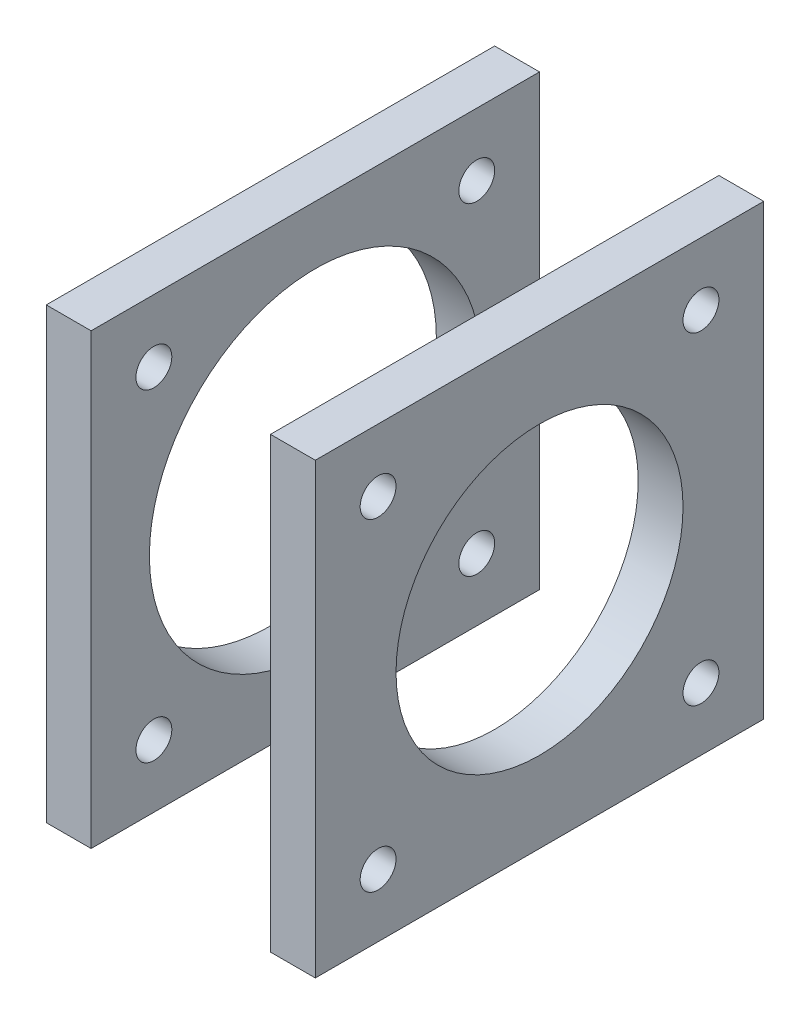
ISO-10303-21;
HEADER;
FILE_DESCRIPTION(('STEP AP214'),'2;1');
FILE_NAME('part.step','',(''),(''),'','','');
FILE_SCHEMA(('AUTOMOTIVE_DESIGN { 1 0 10303 214 1 1 1 1 }'));
ENDSEC;
DATA;
#1=APPLICATION_CONTEXT('core data for automotive mechanical design processes');
#2=APPLICATION_PROTOCOL_DEFINITION('international standard','automotive_design',2000,#1);
#3=PRODUCT_CONTEXT('',#1,'mechanical');
#4=PRODUCT('Part','Part','',(#3));
#5=PRODUCT_RELATED_PRODUCT_CATEGORY('part','',(#4));
#6=PRODUCT_DEFINITION_FORMATION('','',#4);
#7=PRODUCT_DEFINITION_CONTEXT('part definition',#1,'design');
#8=PRODUCT_DEFINITION('design','',#6,#7);
#9=PRODUCT_DEFINITION_SHAPE('','',#8);
#10=(LENGTH_UNIT() NAMED_UNIT(*) SI_UNIT(.MILLI.,.METRE.));
#11=(NAMED_UNIT(*) PLANE_ANGLE_UNIT() SI_UNIT($,.RADIAN.));
#12=(NAMED_UNIT(*) SI_UNIT($,.STERADIAN.) SOLID_ANGLE_UNIT());
#13=UNCERTAINTY_MEASURE_WITH_UNIT(LENGTH_MEASURE(1.E-05),#10,'distance_accuracy_value','');
#14=(GEOMETRIC_REPRESENTATION_CONTEXT(3) GLOBAL_UNCERTAINTY_ASSIGNED_CONTEXT((#13)) GLOBAL_UNIT_ASSIGNED_CONTEXT((#10,
#11,#12)) REPRESENTATION_CONTEXT('',''));
#15=CARTESIAN_POINT('',(0.,0.,0.));
#16=DIRECTION('',(0.,0.,1.));
#17=DIRECTION('',(1.,0.,0.));
#18=AXIS2_PLACEMENT_3D('',#15,#16,#17);
#19=CARTESIAN_POINT('',(30.,0.,0.));
#20=DIRECTION('',(1.,0.,0.));
#21=DIRECTION('',(0.,0.,-1.));
#22=AXIS2_PLACEMENT_3D('',#19,#20,#21);
#23=PLANE('',#22);
#24=CARTESIAN_POINT('',(30.,-24.9155322091732,-25.5692182725278));
#25=DIRECTION('',(1.,0.,0.));
#26=DIRECTION('',(0.,0.,-1.));
#27=AXIS2_PLACEMENT_3D('',#24,#25,#26);
#28=CIRCLE('',#27,2.);
#29=CARTESIAN_POINT('',(30.,-24.9155322091732,-27.5692182725278));
#30=VERTEX_POINT('',#29);
#31=EDGE_CURVE('E137',#30,#30,#28,.T.);
#32=ORIENTED_EDGE('',*,*,#31,.F.);
#33=EDGE_LOOP('',(#32));
#34=FACE_BOUND('',#33,.T.);
#35=CARTESIAN_POINT('',(30.,11.0844677908268,10.4307817274722));
#36=DIRECTION('',(1.,0.,0.));
#37=DIRECTION('',(0.,0.,-1.));
#38=AXIS2_PLACEMENT_3D('',#35,#36,#37);
#39=CIRCLE('',#38,2.);
#40=CARTESIAN_POINT('',(30.,11.0844677908268,8.43078172747223));
#41=VERTEX_POINT('',#40);
#42=EDGE_CURVE('E125',#41,#41,#39,.T.);
#43=ORIENTED_EDGE('',*,*,#42,.F.);
#44=EDGE_LOOP('',(#43));
#45=FACE_BOUND('',#44,.T.);
#46=DIRECTION('',(0.,-1.,0.));
#47=VECTOR('',#46,1.);
#48=CARTESIAN_POINT('',(30.,18.0844677908268,17.4307817274722));
#49=LINE('',#48,#47);
#50=CARTESIAN_POINT('',(30.,18.0844677908268,17.4307817274722));
#51=VERTEX_POINT('',#50);
#52=CARTESIAN_POINT('',(30.,-31.9155322091732,17.4307817274722));
#53=VERTEX_POINT('',#52);
#54=EDGE_CURVE('E95',#51,#53,#49,.T.);
#55=ORIENTED_EDGE('',*,*,#54,.T.);
#56=DIRECTION('',(0.,0.,-1.));
#57=VECTOR('',#56,1.);
#58=CARTESIAN_POINT('',(30.,-31.9155322091732,17.4307817274722));
#59=LINE('',#58,#57);
#60=CARTESIAN_POINT('',(30.,-31.9155322091732,-32.5692182725278));
#61=VERTEX_POINT('',#60);
#62=EDGE_CURVE('E90',#53,#61,#59,.T.);
#63=ORIENTED_EDGE('',*,*,#62,.T.);
#64=DIRECTION('',(0.,1.,0.));
#65=VECTOR('',#64,1.);
#66=CARTESIAN_POINT('',(30.,-31.9155322091732,-32.5692182725278));
#67=LINE('',#66,#65);
#68=CARTESIAN_POINT('',(30.,18.0844677908268,-32.5692182725278));
#69=VERTEX_POINT('',#68);
#70=EDGE_CURVE('E93',#61,#69,#67,.T.);
#71=ORIENTED_EDGE('',*,*,#70,.T.);
#72=DIRECTION('',(0.,0.,1.));
#73=VECTOR('',#72,1.);
#74=CARTESIAN_POINT('',(30.,18.0844677908268,-32.5692182725278));
#75=LINE('',#74,#73);
#76=EDGE_CURVE('E60',#69,#51,#75,.T.);
#77=ORIENTED_EDGE('',*,*,#76,.T.);
#78=EDGE_LOOP('',(#55,#63,#71,#77));
#79=FACE_BOUND('',#78,.T.);
#80=CARTESIAN_POINT('',(30.,-24.9155322091732,10.4307817274722));
#81=DIRECTION('',(1.,0.,0.));
#82=DIRECTION('',(0.,0.,-1.));
#83=AXIS2_PLACEMENT_3D('',#80,#81,#82);
#84=CIRCLE('',#83,2.);
#85=CARTESIAN_POINT('',(30.,-24.9155322091732,8.43078172747223));
#86=VERTEX_POINT('',#85);
#87=EDGE_CURVE('E110',#86,#86,#84,.T.);
#88=ORIENTED_EDGE('',*,*,#87,.F.);
#89=EDGE_LOOP('',(#88));
#90=FACE_BOUND('',#89,.T.);
#91=CARTESIAN_POINT('',(30.,11.0844677908268,-25.5692182725278));
#92=DIRECTION('',(1.,0.,0.));
#93=DIRECTION('',(0.,0.,-1.));
#94=AXIS2_PLACEMENT_3D('',#91,#92,#93);
#95=CIRCLE('',#94,2.);
#96=CARTESIAN_POINT('',(30.,11.0844677908268,-27.5692182725278));
#97=VERTEX_POINT('',#96);
#98=EDGE_CURVE('E131',#97,#97,#95,.T.);
#99=ORIENTED_EDGE('',*,*,#98,.F.);
#100=EDGE_LOOP('',(#99));
#101=FACE_BOUND('',#100,.T.);
#102=CARTESIAN_POINT('',(30.,-6.91553220917321,-7.56921827252777));
#103=DIRECTION('',(1.,0.,0.));
#104=DIRECTION('',(0.,0.,-1.));
#105=AXIS2_PLACEMENT_3D('',#102,#103,#104);
#106=CIRCLE('',#105,16.);
#107=CARTESIAN_POINT('',(30.,-6.91553220917321,-23.5692182725278));
#108=VERTEX_POINT('',#107);
#109=EDGE_CURVE('E143',#108,#108,#106,.T.);
#110=ORIENTED_EDGE('',*,*,#109,.F.);
#111=EDGE_LOOP('',(#110));
#112=FACE_BOUND('',#111,.T.);
#113=ADVANCED_FACE('F43',(#34,#45,#79,#90,#101,#112),#23,.T.);
#114=CARTESIAN_POINT('',(25.,0.,0.));
#115=DIRECTION('',(1.,0.,0.));
#116=DIRECTION('',(0.,0.,-1.));
#117=AXIS2_PLACEMENT_3D('',#114,#115,#116);
#118=PLANE('',#117);
#119=DIRECTION('',(0.,-1.,0.));
#120=VECTOR('',#119,1.);
#121=CARTESIAN_POINT('',(25.,18.0844677908268,17.4307817274722));
#122=LINE('',#121,#120);
#123=CARTESIAN_POINT('',(25.,18.0844677908268,17.4307817274722));
#124=VERTEX_POINT('',#123);
#125=CARTESIAN_POINT('',(25.,-31.9155322091732,17.4307817274722));
#126=VERTEX_POINT('',#125);
#127=EDGE_CURVE('E107',#124,#126,#122,.T.);
#128=ORIENTED_EDGE('',*,*,#127,.F.);
#129=DIRECTION('',(0.,0.,1.));
#130=VECTOR('',#129,1.);
#131=CARTESIAN_POINT('',(25.,18.0844677908268,-32.5692182725278));
#132=LINE('',#131,#130);
#133=CARTESIAN_POINT('',(25.,18.0844677908268,-32.5692182725278));
#134=VERTEX_POINT('',#133);
#135=EDGE_CURVE('E83',#134,#124,#132,.T.);
#136=ORIENTED_EDGE('',*,*,#135,.F.);
#137=DIRECTION('',(0.,1.,0.));
#138=VECTOR('',#137,1.);
#139=CARTESIAN_POINT('',(25.,-31.9155322091732,-32.5692182725278));
#140=LINE('',#139,#138);
#141=CARTESIAN_POINT('',(25.,-31.9155322091732,-32.5692182725278));
#142=VERTEX_POINT('',#141);
#143=EDGE_CURVE('E77',#142,#134,#140,.T.);
#144=ORIENTED_EDGE('',*,*,#143,.F.);
#145=DIRECTION('',(0.,0.,-1.));
#146=VECTOR('',#145,1.);
#147=CARTESIAN_POINT('',(25.,-31.9155322091732,17.4307817274722));
#148=LINE('',#147,#146);
#149=EDGE_CURVE('E99',#126,#142,#148,.T.);
#150=ORIENTED_EDGE('',*,*,#149,.F.);
#151=EDGE_LOOP('',(#128,#136,#144,#150));
#152=FACE_BOUND('',#151,.T.);
#153=CARTESIAN_POINT('',(25.,-24.9155322091732,10.4307817274722));
#154=DIRECTION('',(1.,0.,0.));
#155=DIRECTION('',(0.,0.,-1.));
#156=AXIS2_PLACEMENT_3D('',#153,#154,#155);
#157=CIRCLE('',#156,2.);
#158=CARTESIAN_POINT('',(25.,-24.9155322091732,8.43078172747223));
#159=VERTEX_POINT('',#158);
#160=EDGE_CURVE('E122',#159,#159,#157,.T.);
#161=ORIENTED_EDGE('',*,*,#160,.T.);
#162=EDGE_LOOP('',(#161));
#163=FACE_BOUND('',#162,.T.);
#164=CARTESIAN_POINT('',(25.,11.0844677908268,10.4307817274722));
#165=DIRECTION('',(1.,0.,0.));
#166=DIRECTION('',(0.,0.,-1.));
#167=AXIS2_PLACEMENT_3D('',#164,#165,#166);
#168=CIRCLE('',#167,2.);
#169=CARTESIAN_POINT('',(25.,11.0844677908268,8.43078172747223));
#170=VERTEX_POINT('',#169);
#171=EDGE_CURVE('E128',#170,#170,#168,.T.);
#172=ORIENTED_EDGE('',*,*,#171,.T.);
#173=EDGE_LOOP('',(#172));
#174=FACE_BOUND('',#173,.T.);
#175=CARTESIAN_POINT('',(25.,11.0844677908268,-25.5692182725278));
#176=DIRECTION('',(1.,0.,0.));
#177=DIRECTION('',(0.,0.,-1.));
#178=AXIS2_PLACEMENT_3D('',#175,#176,#177);
#179=CIRCLE('',#178,2.);
#180=CARTESIAN_POINT('',(25.,11.0844677908268,-27.5692182725278));
#181=VERTEX_POINT('',#180);
#182=EDGE_CURVE('E134',#181,#181,#179,.T.);
#183=ORIENTED_EDGE('',*,*,#182,.T.);
#184=EDGE_LOOP('',(#183));
#185=FACE_BOUND('',#184,.T.);
#186=CARTESIAN_POINT('',(25.,-24.9155322091732,-25.5692182725278));
#187=DIRECTION('',(1.,0.,0.));
#188=DIRECTION('',(0.,0.,-1.));
#189=AXIS2_PLACEMENT_3D('',#186,#187,#188);
#190=CIRCLE('',#189,2.);
#191=CARTESIAN_POINT('',(25.,-24.9155322091732,-27.5692182725278));
#192=VERTEX_POINT('',#191);
#193=EDGE_CURVE('E140',#192,#192,#190,.T.);
#194=ORIENTED_EDGE('',*,*,#193,.T.);
#195=EDGE_LOOP('',(#194));
#196=FACE_BOUND('',#195,.T.);
#197=CARTESIAN_POINT('',(25.,-6.91553220917321,-7.56921827252777));
#198=DIRECTION('',(1.,0.,0.));
#199=DIRECTION('',(0.,0.,-1.));
#200=AXIS2_PLACEMENT_3D('',#197,#198,#199);
#201=CIRCLE('',#200,16.);
#202=CARTESIAN_POINT('',(25.,-6.91553220917321,-23.5692182725278));
#203=VERTEX_POINT('',#202);
#204=EDGE_CURVE('E146',#203,#203,#201,.T.);
#205=ORIENTED_EDGE('',*,*,#204,.T.);
#206=EDGE_LOOP('',(#205));
#207=FACE_BOUND('',#206,.T.);
#208=ADVANCED_FACE('F118',(#152,#163,#174,#185,#196,#207),#118,.F.);
#209=CARTESIAN_POINT('',(30.,18.0844677908268,17.4307817274722));
#210=DIRECTION('',(0.,0.,-1.));
#211=DIRECTION('',(-1.,0.,0.));
#212=AXIS2_PLACEMENT_3D('',#209,#210,#211);
#213=PLANE('',#212);
#214=ORIENTED_EDGE('',*,*,#127,.T.);
#215=DIRECTION('',(-1.,0.,0.));
#216=VECTOR('',#215,1.);
#217=CARTESIAN_POINT('',(30.,-31.9155322091732,17.4307817274722));
#218=LINE('',#217,#216);
#219=EDGE_CURVE('E12',#53,#126,#218,.T.);
#220=ORIENTED_EDGE('',*,*,#219,.F.);
#221=ORIENTED_EDGE('',*,*,#54,.F.);
#222=DIRECTION('',(-1.,0.,0.));
#223=VECTOR('',#222,1.);
#224=CARTESIAN_POINT('',(30.,18.0844677908268,17.4307817274722));
#225=LINE('',#224,#223);
#226=EDGE_CURVE('E103',#51,#124,#225,.T.);
#227=ORIENTED_EDGE('',*,*,#226,.T.);
#228=EDGE_LOOP('',(#214,#220,#221,#227));
#229=FACE_BOUND('',#228,.T.);
#230=ADVANCED_FACE('F45',(#229),#213,.F.);
#231=CARTESIAN_POINT('',(30.,-31.9155322091732,17.4307817274722));
#232=DIRECTION('',(0.,1.,0.));
#233=DIRECTION('',(0.,0.,1.));
#234=AXIS2_PLACEMENT_3D('',#231,#232,#233);
#235=PLANE('',#234);
#236=ORIENTED_EDGE('',*,*,#149,.T.);
#237=DIRECTION('',(-1.,0.,0.));
#238=VECTOR('',#237,1.);
#239=CARTESIAN_POINT('',(30.,-31.9155322091732,-32.5692182725278));
#240=LINE('',#239,#238);
#241=EDGE_CURVE('E52',#61,#142,#240,.T.);
#242=ORIENTED_EDGE('',*,*,#241,.F.);
#243=ORIENTED_EDGE('',*,*,#62,.F.);
#244=ORIENTED_EDGE('',*,*,#219,.T.);
#245=EDGE_LOOP('',(#236,#242,#243,#244));
#246=FACE_BOUND('',#245,.T.);
#247=ADVANCED_FACE('F98',(#246),#235,.F.);
#248=CARTESIAN_POINT('',(30.,-31.9155322091732,-32.5692182725278));
#249=DIRECTION('',(0.,0.,1.));
#250=DIRECTION('',(1.,0.,0.));
#251=AXIS2_PLACEMENT_3D('',#248,#249,#250);
#252=PLANE('',#251);
#253=ORIENTED_EDGE('',*,*,#143,.T.);
#254=DIRECTION('',(-1.,0.,0.));
#255=VECTOR('',#254,1.);
#256=CARTESIAN_POINT('',(30.,18.0844677908268,-32.5692182725278));
#257=LINE('',#256,#255);
#258=EDGE_CURVE('E100',#69,#134,#257,.T.);
#259=ORIENTED_EDGE('',*,*,#258,.F.);
#260=ORIENTED_EDGE('',*,*,#70,.F.);
#261=ORIENTED_EDGE('',*,*,#241,.T.);
#262=EDGE_LOOP('',(#253,#259,#260,#261));
#263=FACE_BOUND('',#262,.T.);
#264=ADVANCED_FACE('F101',(#263),#252,.F.);
#265=CARTESIAN_POINT('',(30.,18.0844677908268,-32.5692182725278));
#266=DIRECTION('',(0.,-1.,0.));
#267=DIRECTION('',(0.,0.,-1.));
#268=AXIS2_PLACEMENT_3D('',#265,#266,#267);
#269=PLANE('',#268);
#270=ORIENTED_EDGE('',*,*,#135,.T.);
#271=ORIENTED_EDGE('',*,*,#226,.F.);
#272=ORIENTED_EDGE('',*,*,#76,.F.);
#273=ORIENTED_EDGE('',*,*,#258,.T.);
#274=EDGE_LOOP('',(#270,#271,#272,#273));
#275=FACE_BOUND('',#274,.T.);
#276=ADVANCED_FACE('F115',(#275),#269,.F.);
#277=CARTESIAN_POINT('',(30.,-24.9155322091732,10.4307817274722));
#278=DIRECTION('',(-1.,0.,0.));
#279=DIRECTION('',(0.,0.,1.));
#280=AXIS2_PLACEMENT_3D('',#277,#278,#279);
#281=CYLINDRICAL_SURFACE('',#280,2.);
#282=ORIENTED_EDGE('',*,*,#87,.T.);
#283=EDGE_LOOP('',(#282));
#284=FACE_BOUND('',#283,.T.);
#285=ORIENTED_EDGE('',*,*,#160,.F.);
#286=EDGE_LOOP('',(#285));
#287=FACE_BOUND('',#286,.T.);
#288=ADVANCED_FACE('F165',(#284,#287),#281,.F.);
#289=CARTESIAN_POINT('',(30.,11.0844677908268,10.4307817274722));
#290=DIRECTION('',(-1.,0.,0.));
#291=DIRECTION('',(0.,0.,1.));
#292=AXIS2_PLACEMENT_3D('',#289,#290,#291);
#293=CYLINDRICAL_SURFACE('',#292,2.);
#294=ORIENTED_EDGE('',*,*,#42,.T.);
#295=EDGE_LOOP('',(#294));
#296=FACE_BOUND('',#295,.T.);
#297=ORIENTED_EDGE('',*,*,#171,.F.);
#298=EDGE_LOOP('',(#297));
#299=FACE_BOUND('',#298,.T.);
#300=ADVANCED_FACE('F211',(#296,#299),#293,.F.);
#301=CARTESIAN_POINT('',(30.,11.0844677908268,-25.5692182725278));
#302=DIRECTION('',(-1.,0.,0.));
#303=DIRECTION('',(0.,0.,1.));
#304=AXIS2_PLACEMENT_3D('',#301,#302,#303);
#305=CYLINDRICAL_SURFACE('',#304,2.);
#306=ORIENTED_EDGE('',*,*,#98,.T.);
#307=EDGE_LOOP('',(#306));
#308=FACE_BOUND('',#307,.T.);
#309=ORIENTED_EDGE('',*,*,#182,.F.);
#310=EDGE_LOOP('',(#309));
#311=FACE_BOUND('',#310,.T.);
#312=ADVANCED_FACE('F219',(#308,#311),#305,.F.);
#313=CARTESIAN_POINT('',(30.,-24.9155322091732,-25.5692182725278));
#314=DIRECTION('',(-1.,0.,0.));
#315=DIRECTION('',(0.,0.,1.));
#316=AXIS2_PLACEMENT_3D('',#313,#314,#315);
#317=CYLINDRICAL_SURFACE('',#316,2.);
#318=ORIENTED_EDGE('',*,*,#31,.T.);
#319=EDGE_LOOP('',(#318));
#320=FACE_BOUND('',#319,.T.);
#321=ORIENTED_EDGE('',*,*,#193,.F.);
#322=EDGE_LOOP('',(#321));
#323=FACE_BOUND('',#322,.T.);
#324=ADVANCED_FACE('F227',(#320,#323),#317,.F.);
#325=CARTESIAN_POINT('',(30.,-6.91553220917321,-7.56921827252777));
#326=DIRECTION('',(-1.,0.,0.));
#327=DIRECTION('',(0.,0.,1.));
#328=AXIS2_PLACEMENT_3D('',#325,#326,#327);
#329=CYLINDRICAL_SURFACE('',#328,16.);
#330=ORIENTED_EDGE('',*,*,#109,.T.);
#331=EDGE_LOOP('',(#330));
#332=FACE_BOUND('',#331,.T.);
#333=ORIENTED_EDGE('',*,*,#204,.F.);
#334=EDGE_LOOP('',(#333));
#335=FACE_BOUND('',#334,.T.);
#336=ADVANCED_FACE('F152',(#332,#335),#329,.F.);
#337=CLOSED_SHELL('',(#113,#208,#230,#247,#264,#276,#288,#300,#312,#324,#336));
#338=MANIFOLD_SOLID_BREP('B2',#337);
#339=CARTESIAN_POINT('',(5.,0.,0.));
#340=DIRECTION('',(-1.,0.,0.));
#341=DIRECTION('',(0.,0.,1.));
#342=AXIS2_PLACEMENT_3D('',#339,#340,#341);
#343=PLANE('',#342);
#344=DIRECTION('',(0.,1.,0.));
#345=VECTOR('',#344,1.);
#346=CARTESIAN_POINT('',(5.,-31.9155322091732,-32.5692182725278));
#347=LINE('',#346,#345);
#348=CARTESIAN_POINT('',(5.,-31.9155322091732,-32.5692182725278));
#349=VERTEX_POINT('',#348);
#350=CARTESIAN_POINT('',(5.,18.0844677908268,-32.5692182725278));
#351=VERTEX_POINT('',#350);
#352=EDGE_CURVE('E324',#349,#351,#347,.T.);
#353=ORIENTED_EDGE('',*,*,#352,.T.);
#354=DIRECTION('',(0.,0.,1.));
#355=VECTOR('',#354,1.);
#356=CARTESIAN_POINT('',(5.,18.0844677908268,17.4307817274722));
#357=LINE('',#356,#355);
#358=CARTESIAN_POINT('',(5.,18.0844677908268,17.4307817274722));
#359=VERTEX_POINT('',#358);
#360=EDGE_CURVE('E319',#351,#359,#357,.T.);
#361=ORIENTED_EDGE('',*,*,#360,.T.);
#362=DIRECTION('',(0.,-1.,0.));
#363=VECTOR('',#362,1.);
#364=CARTESIAN_POINT('',(5.,-31.9155322091732,17.4307817274722));
#365=LINE('',#364,#363);
#366=CARTESIAN_POINT('',(5.,-31.9155322091732,17.4307817274722));
#367=VERTEX_POINT('',#366);
#368=EDGE_CURVE('E322',#359,#367,#365,.T.);
#369=ORIENTED_EDGE('',*,*,#368,.T.);
#370=DIRECTION('',(0.,0.,-1.));
#371=VECTOR('',#370,1.);
#372=CARTESIAN_POINT('',(5.,-31.9155322091732,17.4307817274722));
#373=LINE('',#372,#371);
#374=EDGE_CURVE('E289',#367,#349,#373,.T.);
#375=ORIENTED_EDGE('',*,*,#374,.T.);
#376=EDGE_LOOP('',(#353,#361,#369,#375));
#377=FACE_BOUND('',#376,.T.);
#378=CARTESIAN_POINT('',(5.,11.0844677908268,10.4307817274722));
#379=DIRECTION('',(1.,0.,0.));
#380=DIRECTION('',(0.,0.,-1.));
#381=AXIS2_PLACEMENT_3D('',#378,#379,#380);
#382=CIRCLE('',#381,2.);
#383=CARTESIAN_POINT('',(5.,11.0844677908268,8.43078172747223));
#384=VERTEX_POINT('',#383);
#385=EDGE_CURVE('E339',#384,#384,#382,.T.);
#386=ORIENTED_EDGE('',*,*,#385,.F.);
#387=EDGE_LOOP('',(#386));
#388=FACE_BOUND('',#387,.T.);
#389=CARTESIAN_POINT('',(5.,-24.9155322091732,10.4307817274722));
#390=DIRECTION('',(1.,0.,0.));
#391=DIRECTION('',(0.,0.,1.));
#392=AXIS2_PLACEMENT_3D('',#389,#390,#391);
#393=CIRCLE('',#392,2.);
#394=CARTESIAN_POINT('',(5.,-24.9155322091732,12.4307817274722));
#395=VERTEX_POINT('',#394);
#396=EDGE_CURVE('E354',#395,#395,#393,.T.);
#397=ORIENTED_EDGE('',*,*,#396,.F.);
#398=EDGE_LOOP('',(#397));
#399=FACE_BOUND('',#398,.T.);
#400=CARTESIAN_POINT('',(5.,-24.9155322091732,-25.5692182725278));
#401=DIRECTION('',(1.,0.,0.));
#402=DIRECTION('',(0.,0.,-1.));
#403=AXIS2_PLACEMENT_3D('',#400,#401,#402);
#404=CIRCLE('',#403,2.);
#405=CARTESIAN_POINT('',(5.,-24.9155322091732,-27.5692182725278));
#406=VERTEX_POINT('',#405);
#407=EDGE_CURVE('E360',#406,#406,#404,.T.);
#408=ORIENTED_EDGE('',*,*,#407,.F.);
#409=EDGE_LOOP('',(#408));
#410=FACE_BOUND('',#409,.T.);
#411=CARTESIAN_POINT('',(5.,11.0844677908268,-25.5692182725278));
#412=DIRECTION('',(1.,0.,0.));
#413=DIRECTION('',(0.,0.,1.));
#414=AXIS2_PLACEMENT_3D('',#411,#412,#413);
#415=CIRCLE('',#414,2.);
#416=CARTESIAN_POINT('',(5.,11.0844677908268,-23.5692182725278));
#417=VERTEX_POINT('',#416);
#418=EDGE_CURVE('E366',#417,#417,#415,.T.);
#419=ORIENTED_EDGE('',*,*,#418,.F.);
#420=EDGE_LOOP('',(#419));
#421=FACE_BOUND('',#420,.T.);
#422=CARTESIAN_POINT('',(5.,-6.91553220917321,-7.56921827252777));
#423=DIRECTION('',(1.,0.,0.));
#424=DIRECTION('',(0.,0.,-1.));
#425=AXIS2_PLACEMENT_3D('',#422,#423,#424);
#426=CIRCLE('',#425,18.5);
#427=CARTESIAN_POINT('',(5.,-6.91553220917321,-26.0692182725278));
#428=VERTEX_POINT('',#427);
#429=EDGE_CURVE('E372',#428,#428,#426,.T.);
#430=ORIENTED_EDGE('',*,*,#429,.F.);
#431=EDGE_LOOP('',(#430));
#432=FACE_BOUND('',#431,.T.);
#433=ADVANCED_FACE('F272',(#377,#388,#399,#410,#421,#432),#343,.F.);
#434=CARTESIAN_POINT('',(0.,0.,0.));
#435=DIRECTION('',(-1.,0.,0.));
#436=DIRECTION('',(0.,0.,1.));
#437=AXIS2_PLACEMENT_3D('',#434,#435,#436);
#438=PLANE('',#437);
#439=CARTESIAN_POINT('',(0.,11.0844677908268,-25.5692182725278));
#440=DIRECTION('',(1.,0.,0.));
#441=DIRECTION('',(0.,0.,1.));
#442=AXIS2_PLACEMENT_3D('',#439,#440,#441);
#443=CIRCLE('',#442,2.);
#444=CARTESIAN_POINT('',(0.,11.0844677908268,-23.5692182725278));
#445=VERTEX_POINT('',#444);
#446=EDGE_CURVE('E369',#445,#445,#443,.T.);
#447=ORIENTED_EDGE('',*,*,#446,.T.);
#448=EDGE_LOOP('',(#447));
#449=FACE_BOUND('',#448,.T.);
#450=CARTESIAN_POINT('',(0.,-24.9155322091732,10.4307817274722));
#451=DIRECTION('',(1.,0.,0.));
#452=DIRECTION('',(0.,0.,1.));
#453=AXIS2_PLACEMENT_3D('',#450,#451,#452);
#454=CIRCLE('',#453,2.);
#455=CARTESIAN_POINT('',(0.,-24.9155322091732,12.4307817274722));
#456=VERTEX_POINT('',#455);
#457=EDGE_CURVE('E357',#456,#456,#454,.T.);
#458=ORIENTED_EDGE('',*,*,#457,.T.);
#459=EDGE_LOOP('',(#458));
#460=FACE_BOUND('',#459,.T.);
#461=DIRECTION('',(0.,1.,0.));
#462=VECTOR('',#461,1.);
#463=CARTESIAN_POINT('',(0.,-31.9155322091732,-32.5692182725278));
#464=LINE('',#463,#462);
#465=CARTESIAN_POINT('',(0.,-31.9155322091732,-32.5692182725278));
#466=VERTEX_POINT('',#465);
#467=CARTESIAN_POINT('',(0.,18.0844677908268,-32.5692182725278));
#468=VERTEX_POINT('',#467);
#469=EDGE_CURVE('E336',#466,#468,#464,.T.);
#470=ORIENTED_EDGE('',*,*,#469,.F.);
#471=DIRECTION('',(0.,0.,-1.));
#472=VECTOR('',#471,1.);
#473=CARTESIAN_POINT('',(0.,-31.9155322091732,17.4307817274722));
#474=LINE('',#473,#472);
#475=CARTESIAN_POINT('',(0.,-31.9155322091732,17.4307817274722));
#476=VERTEX_POINT('',#475);
#477=EDGE_CURVE('E312',#476,#466,#474,.T.);
#478=ORIENTED_EDGE('',*,*,#477,.F.);
#479=DIRECTION('',(0.,-1.,0.));
#480=VECTOR('',#479,1.);
#481=CARTESIAN_POINT('',(0.,-31.9155322091732,17.4307817274722));
#482=LINE('',#481,#480);
#483=CARTESIAN_POINT('',(0.,18.0844677908268,17.4307817274722));
#484=VERTEX_POINT('',#483);
#485=EDGE_CURVE('E306',#484,#476,#482,.T.);
#486=ORIENTED_EDGE('',*,*,#485,.F.);
#487=DIRECTION('',(0.,0.,1.));
#488=VECTOR('',#487,1.);
#489=CARTESIAN_POINT('',(0.,18.0844677908268,17.4307817274722));
#490=LINE('',#489,#488);
#491=EDGE_CURVE('E328',#468,#484,#490,.T.);
#492=ORIENTED_EDGE('',*,*,#491,.F.);
#493=EDGE_LOOP('',(#470,#478,#486,#492));
#494=FACE_BOUND('',#493,.T.);
#495=CARTESIAN_POINT('',(0.,11.0844677908268,10.4307817274722));
#496=DIRECTION('',(1.,0.,0.));
#497=DIRECTION('',(0.,0.,-1.));
#498=AXIS2_PLACEMENT_3D('',#495,#496,#497);
#499=CIRCLE('',#498,2.);
#500=CARTESIAN_POINT('',(0.,11.0844677908268,8.43078172747223));
#501=VERTEX_POINT('',#500);
#502=EDGE_CURVE('E351',#501,#501,#499,.T.);
#503=ORIENTED_EDGE('',*,*,#502,.T.);
#504=EDGE_LOOP('',(#503));
#505=FACE_BOUND('',#504,.T.);
#506=CARTESIAN_POINT('',(0.,-24.9155322091732,-25.5692182725278));
#507=DIRECTION('',(1.,0.,0.));
#508=DIRECTION('',(0.,0.,-1.));
#509=AXIS2_PLACEMENT_3D('',#506,#507,#508);
#510=CIRCLE('',#509,2.);
#511=CARTESIAN_POINT('',(0.,-24.9155322091732,-27.5692182725278));
#512=VERTEX_POINT('',#511);
#513=EDGE_CURVE('E363',#512,#512,#510,.T.);
#514=ORIENTED_EDGE('',*,*,#513,.T.);
#515=EDGE_LOOP('',(#514));
#516=FACE_BOUND('',#515,.T.);
#517=CARTESIAN_POINT('',(0.,-6.91553220917321,-7.56921827252777));
#518=DIRECTION('',(1.,0.,0.));
#519=DIRECTION('',(0.,0.,-1.));
#520=AXIS2_PLACEMENT_3D('',#517,#518,#519);
#521=CIRCLE('',#520,18.5);
#522=CARTESIAN_POINT('',(0.,-6.91553220917321,-26.0692182725278));
#523=VERTEX_POINT('',#522);
#524=EDGE_CURVE('E375',#523,#523,#521,.T.);
#525=ORIENTED_EDGE('',*,*,#524,.T.);
#526=EDGE_LOOP('',(#525));
#527=FACE_BOUND('',#526,.T.);
#528=ADVANCED_FACE('F347',(#449,#460,#494,#505,#516,#527),#438,.T.);
#529=CARTESIAN_POINT('',(5.,-31.9155322091732,-32.5692182725278));
#530=DIRECTION('',(0.,0.,1.));
#531=DIRECTION('',(1.,0.,0.));
#532=AXIS2_PLACEMENT_3D('',#529,#530,#531);
#533=PLANE('',#532);
#534=ORIENTED_EDGE('',*,*,#469,.T.);
#535=DIRECTION('',(-1.,0.,0.));
#536=VECTOR('',#535,1.);
#537=CARTESIAN_POINT('',(5.,18.0844677908268,-32.5692182725278));
#538=LINE('',#537,#536);
#539=EDGE_CURVE('E41',#351,#468,#538,.T.);
#540=ORIENTED_EDGE('',*,*,#539,.F.);
#541=ORIENTED_EDGE('',*,*,#352,.F.);
#542=DIRECTION('',(-1.,0.,0.));
#543=VECTOR('',#542,1.);
#544=CARTESIAN_POINT('',(5.,-31.9155322091732,-32.5692182725278));
#545=LINE('',#544,#543);
#546=EDGE_CURVE('E332',#349,#466,#545,.T.);
#547=ORIENTED_EDGE('',*,*,#546,.T.);
#548=EDGE_LOOP('',(#534,#540,#541,#547));
#549=FACE_BOUND('',#548,.T.);
#550=ADVANCED_FACE('F274',(#549),#533,.F.);
#551=CARTESIAN_POINT('',(5.,18.0844677908268,17.4307817274722));
#552=DIRECTION('',(0.,-1.,0.));
#553=DIRECTION('',(0.,0.,-1.));
#554=AXIS2_PLACEMENT_3D('',#551,#552,#553);
#555=PLANE('',#554);
#556=ORIENTED_EDGE('',*,*,#491,.T.);
#557=DIRECTION('',(-1.,0.,0.));
#558=VECTOR('',#557,1.);
#559=CARTESIAN_POINT('',(5.,18.0844677908268,17.4307817274722));
#560=LINE('',#559,#558);
#561=EDGE_CURVE('E281',#359,#484,#560,.T.);
#562=ORIENTED_EDGE('',*,*,#561,.F.);
#563=ORIENTED_EDGE('',*,*,#360,.F.);
#564=ORIENTED_EDGE('',*,*,#539,.T.);
#565=EDGE_LOOP('',(#556,#562,#563,#564));
#566=FACE_BOUND('',#565,.T.);
#567=ADVANCED_FACE('F327',(#566),#555,.F.);
#568=CARTESIAN_POINT('',(5.,-31.9155322091732,17.4307817274722));
#569=DIRECTION('',(0.,0.,-1.));
#570=DIRECTION('',(-1.,0.,0.));
#571=AXIS2_PLACEMENT_3D('',#568,#569,#570);
#572=PLANE('',#571);
#573=ORIENTED_EDGE('',*,*,#485,.T.);
#574=DIRECTION('',(-1.,0.,0.));
#575=VECTOR('',#574,1.);
#576=CARTESIAN_POINT('',(5.,-31.9155322091732,17.4307817274722));
#577=LINE('',#576,#575);
#578=EDGE_CURVE('E329',#367,#476,#577,.T.);
#579=ORIENTED_EDGE('',*,*,#578,.F.);
#580=ORIENTED_EDGE('',*,*,#368,.F.);
#581=ORIENTED_EDGE('',*,*,#561,.T.);
#582=EDGE_LOOP('',(#573,#579,#580,#581));
#583=FACE_BOUND('',#582,.T.);
#584=ADVANCED_FACE('F330',(#583),#572,.F.);
#585=CARTESIAN_POINT('',(5.,-31.9155322091732,17.4307817274722));
#586=DIRECTION('',(0.,1.,0.));
#587=DIRECTION('',(0.,0.,1.));
#588=AXIS2_PLACEMENT_3D('',#585,#586,#587);
#589=PLANE('',#588);
#590=ORIENTED_EDGE('',*,*,#477,.T.);
#591=ORIENTED_EDGE('',*,*,#546,.F.);
#592=ORIENTED_EDGE('',*,*,#374,.F.);
#593=ORIENTED_EDGE('',*,*,#578,.T.);
#594=EDGE_LOOP('',(#590,#591,#592,#593));
#595=FACE_BOUND('',#594,.T.);
#596=ADVANCED_FACE('F344',(#595),#589,.F.);
#597=CARTESIAN_POINT('',(5.,11.0844677908268,10.4307817274722));
#598=DIRECTION('',(-1.,0.,0.));
#599=DIRECTION('',(0.,0.,1.));
#600=AXIS2_PLACEMENT_3D('',#597,#598,#599);
#601=CYLINDRICAL_SURFACE('',#600,2.);
#602=ORIENTED_EDGE('',*,*,#385,.T.);
#603=EDGE_LOOP('',(#602));
#604=FACE_BOUND('',#603,.T.);
#605=ORIENTED_EDGE('',*,*,#502,.F.);
#606=EDGE_LOOP('',(#605));
#607=FACE_BOUND('',#606,.T.);
#608=ADVANCED_FACE('F392',(#604,#607),#601,.F.);
#609=CARTESIAN_POINT('',(5.,-24.9155322091732,10.4307817274722));
#610=DIRECTION('',(-1.,0.,0.));
#611=DIRECTION('',(0.,0.,1.));
#612=AXIS2_PLACEMENT_3D('',#609,#610,#611);
#613=CYLINDRICAL_SURFACE('',#612,2.);
#614=ORIENTED_EDGE('',*,*,#396,.T.);
#615=EDGE_LOOP('',(#614));
#616=FACE_BOUND('',#615,.T.);
#617=ORIENTED_EDGE('',*,*,#457,.F.);
#618=EDGE_LOOP('',(#617));
#619=FACE_BOUND('',#618,.T.);
#620=ADVANCED_FACE('F438',(#616,#619),#613,.F.);
#621=CARTESIAN_POINT('',(5.,-24.9155322091732,-25.5692182725278));
#622=DIRECTION('',(-1.,0.,0.));
#623=DIRECTION('',(0.,0.,1.));
#624=AXIS2_PLACEMENT_3D('',#621,#622,#623);
#625=CYLINDRICAL_SURFACE('',#624,2.);
#626=ORIENTED_EDGE('',*,*,#407,.T.);
#627=EDGE_LOOP('',(#626));
#628=FACE_BOUND('',#627,.T.);
#629=ORIENTED_EDGE('',*,*,#513,.F.);
#630=EDGE_LOOP('',(#629));
#631=FACE_BOUND('',#630,.T.);
#632=ADVANCED_FACE('F446',(#628,#631),#625,.F.);
#633=CARTESIAN_POINT('',(5.,11.0844677908268,-25.5692182725278));
#634=DIRECTION('',(-1.,0.,0.));
#635=DIRECTION('',(0.,0.,1.));
#636=AXIS2_PLACEMENT_3D('',#633,#634,#635);
#637=CYLINDRICAL_SURFACE('',#636,2.);
#638=ORIENTED_EDGE('',*,*,#418,.T.);
#639=EDGE_LOOP('',(#638));
#640=FACE_BOUND('',#639,.T.);
#641=ORIENTED_EDGE('',*,*,#446,.F.);
#642=EDGE_LOOP('',(#641));
#643=FACE_BOUND('',#642,.T.);
#644=ADVANCED_FACE('F454',(#640,#643),#637,.F.);
#645=CARTESIAN_POINT('',(5.,-6.91553220917321,-7.56921827252777));
#646=DIRECTION('',(-1.,0.,0.));
#647=DIRECTION('',(0.,0.,1.));
#648=AXIS2_PLACEMENT_3D('',#645,#646,#647);
#649=CYLINDRICAL_SURFACE('',#648,18.5);
#650=ORIENTED_EDGE('',*,*,#429,.T.);
#651=EDGE_LOOP('',(#650));
#652=FACE_BOUND('',#651,.T.);
#653=ORIENTED_EDGE('',*,*,#524,.F.);
#654=EDGE_LOOP('',(#653));
#655=FACE_BOUND('',#654,.T.);
#656=ADVANCED_FACE('F381',(#652,#655),#649,.F.);
#657=CLOSED_SHELL('',(#433,#528,#550,#567,#584,#596,#608,#620,#632,#644,#656));
#658=MANIFOLD_SOLID_BREP('B6',#657);
#659=ADVANCED_BREP_SHAPE_REPRESENTATION('',(#18,#338,#658),#14);
#660=SHAPE_DEFINITION_REPRESENTATION(#9,#659);
ENDSEC;
END-ISO-10303-21;
